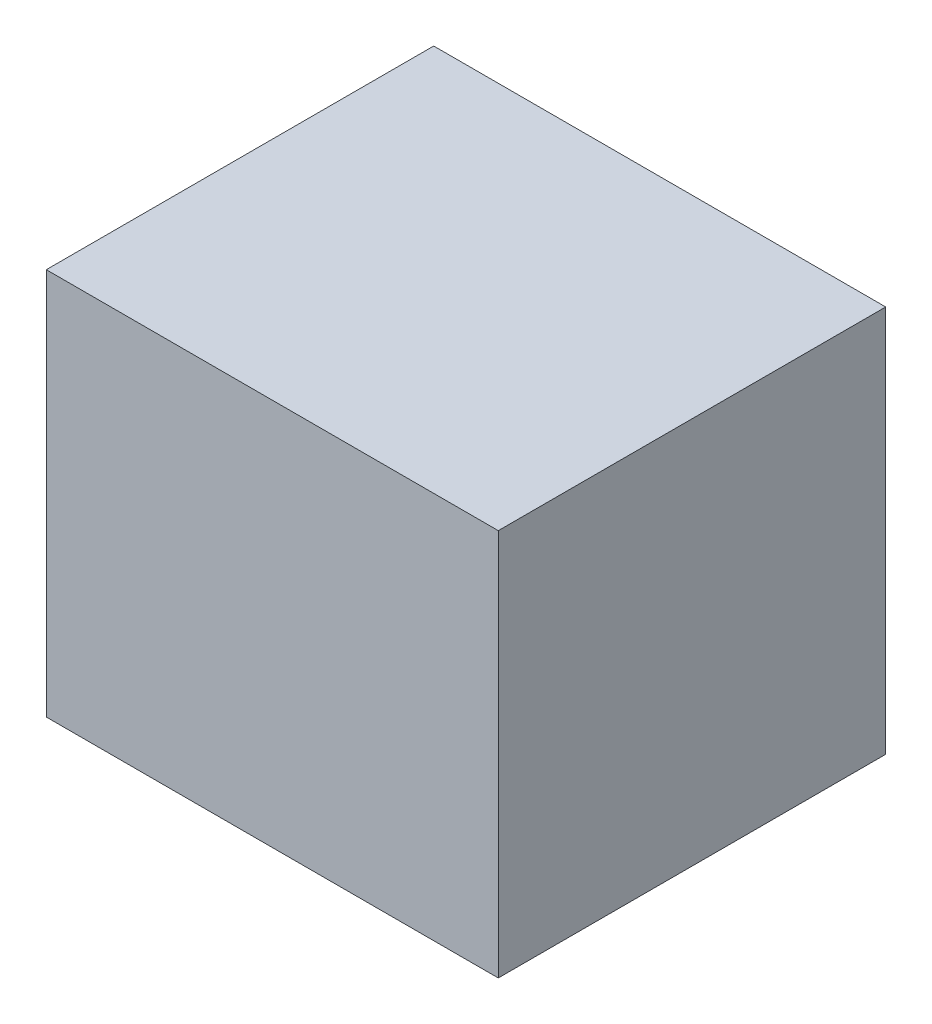
ISO-10303-21;
HEADER;
FILE_DESCRIPTION(('STEP AP214'),'2;1');
FILE_NAME('part.step','',(''),(''),'','','');
FILE_SCHEMA(('AUTOMOTIVE_DESIGN { 1 0 10303 214 1 1 1 1 }'));
ENDSEC;
DATA;
#1=APPLICATION_CONTEXT('core data for automotive mechanical design processes');
#2=APPLICATION_PROTOCOL_DEFINITION('international standard','automotive_design',2000,#1);
#3=PRODUCT_CONTEXT('',#1,'mechanical');
#4=PRODUCT('Part','Part','',(#3));
#5=PRODUCT_RELATED_PRODUCT_CATEGORY('part','',(#4));
#6=PRODUCT_DEFINITION_FORMATION('','',#4);
#7=PRODUCT_DEFINITION_CONTEXT('part definition',#1,'design');
#8=PRODUCT_DEFINITION('design','',#6,#7);
#9=PRODUCT_DEFINITION_SHAPE('','',#8);
#10=(LENGTH_UNIT() NAMED_UNIT(*) SI_UNIT(.MILLI.,.METRE.));
#11=(NAMED_UNIT(*) PLANE_ANGLE_UNIT() SI_UNIT($,.RADIAN.));
#12=(NAMED_UNIT(*) SI_UNIT($,.STERADIAN.) SOLID_ANGLE_UNIT());
#13=UNCERTAINTY_MEASURE_WITH_UNIT(LENGTH_MEASURE(1.E-05),#10,'distance_accuracy_value','');
#14=(GEOMETRIC_REPRESENTATION_CONTEXT(3) GLOBAL_UNCERTAINTY_ASSIGNED_CONTEXT((#13)) GLOBAL_UNIT_ASSIGNED_CONTEXT((#10,
#11,#12)) REPRESENTATION_CONTEXT('',''));
#15=CARTESIAN_POINT('',(0.,0.,0.));
#16=DIRECTION('',(0.,0.,1.));
#17=DIRECTION('',(1.,0.,0.));
#18=AXIS2_PLACEMENT_3D('',#15,#16,#17);
#19=CARTESIAN_POINT('',(-30.4528021271219,2.29096849845756,2.71031462000001));
#20=CARTESIAN_POINT('',(-30.4528021271219,2.29096849845756,1.99031606000001));
#21=CARTESIAN_POINT('',(-30.4528021271219,1.57096993845756,2.71031462000001));
#22=CARTESIAN_POINT('',(-30.4528021271219,1.57096993845756,1.99031606000001));
#23=(BOUNDED_SURFACE() B_SPLINE_SURFACE(1,1,((#19,#20),(#21,#22)),.UNSPECIFIED.,.F.,.F.,
.F.) B_SPLINE_SURFACE_WITH_KNOTS((2,2),(2,2),(-5.999988E-05,0.00065999868),(-0.00065999868,
5.999988E-05),.UNSPECIFIED.) GEOMETRIC_REPRESENTATION_ITEM() RATIONAL_B_SPLINE_SURFACE(((1.,1.),
(1.,1.))) REPRESENTATION_ITEM('') SURFACE());
#24=CARTESIAN_POINT('',(-30.4528021271219,1.63096981845756,2.05031594000001));
#25=CARTESIAN_POINT('',(-30.4528021271219,2.23096861845756,2.05031594000001));
#26=(BOUNDED_CURVE() B_SPLINE_CURVE(1,(#24,#25),.UNSPECIFIED.,.F.,
.F.) B_SPLINE_CURVE_WITH_KNOTS((2,2),(0.,0.0005999988),
.UNSPECIFIED.) CURVE() GEOMETRIC_REPRESENTATION_ITEM() RATIONAL_B_SPLINE_CURVE((1.,1.)) REPRESENTATION_ITEM(''));
#27=CARTESIAN_POINT('',(-30.4528021271219,1.63096981845756,2.05031594000001));
#28=VERTEX_POINT('',#27);
#29=CARTESIAN_POINT('',(-30.4528021271219,2.23096861845756,2.05031594000001));
#30=VERTEX_POINT('',#29);
#31=EDGE_CURVE('E23',#28,#30,#26,.T.);
#32=CARTESIAN_POINT('',(-30.4528021271219,2.23096861845756,2.05031594000001));
#33=CARTESIAN_POINT('',(-30.4528021271219,2.23096861845756,2.65031474000001));
#34=(BOUNDED_CURVE() B_SPLINE_CURVE(1,(#32,#33),.UNSPECIFIED.,.F.,
.F.) B_SPLINE_CURVE_WITH_KNOTS((2,2),(0.,0.0005999988),
.UNSPECIFIED.) CURVE() GEOMETRIC_REPRESENTATION_ITEM() RATIONAL_B_SPLINE_CURVE((1.,1.)) REPRESENTATION_ITEM(''));
#35=CARTESIAN_POINT('',(-30.4528021271219,2.23096861845756,2.65031474000001));
#36=VERTEX_POINT('',#35);
#37=EDGE_CURVE('E11',#30,#36,#34,.T.);
#38=CARTESIAN_POINT('',(-30.4528021271219,1.63096981845756,2.65031474000001));
#39=CARTESIAN_POINT('',(-30.4528021271219,2.23096861845756,2.65031474000001));
#40=(BOUNDED_CURVE() B_SPLINE_CURVE(1,(#38,#39),.UNSPECIFIED.,.F.,
.F.) B_SPLINE_CURVE_WITH_KNOTS((2,2),(0.,0.0005999988),
.UNSPECIFIED.) CURVE() GEOMETRIC_REPRESENTATION_ITEM() RATIONAL_B_SPLINE_CURVE((1.,1.)) REPRESENTATION_ITEM(''));
#41=CARTESIAN_POINT('',(-30.4528021271219,1.63096981845756,2.65031474000001));
#42=VERTEX_POINT('',#41);
#43=EDGE_CURVE('E112',#42,#36,#40,.T.);
#44=CARTESIAN_POINT('',(-30.4528021271219,1.63096981845756,2.05031594000001));
#45=CARTESIAN_POINT('',(-30.4528021271219,1.63096981845756,2.65031474000001));
#46=(BOUNDED_CURVE() B_SPLINE_CURVE(1,(#44,#45),.UNSPECIFIED.,.F.,
.F.) B_SPLINE_CURVE_WITH_KNOTS((2,2),(0.,0.0005999988),
.UNSPECIFIED.) CURVE() GEOMETRIC_REPRESENTATION_ITEM() RATIONAL_B_SPLINE_CURVE((1.,1.)) REPRESENTATION_ITEM(''));
#47=EDGE_CURVE('E71',#28,#42,#46,.T.);
#48=ORIENTED_EDGE('',*,*,#31,.T.);
#49=ORIENTED_EDGE('',*,*,#37,.T.);
#50=ORIENTED_EDGE('',*,*,#43,.F.);
#51=ORIENTED_EDGE('',*,*,#47,.F.);
#52=EDGE_LOOP('',(#48,#49,#50,#51));
#53=FACE_BOUND('',#52,.T.);
#54=ADVANCED_FACE('F17',(#53),#23,.T.);
#55=CARTESIAN_POINT('',(-31.2228033811219,2.23096861845756,2.71031462000001));
#56=CARTESIAN_POINT('',(-31.2228033811219,2.23096861845756,1.99031606000001));
#57=CARTESIAN_POINT('',(-30.3828020131219,2.23096861845756,2.71031462000001));
#58=CARTESIAN_POINT('',(-30.3828020131219,2.23096861845756,1.99031606000001));
#59=(BOUNDED_SURFACE() B_SPLINE_SURFACE(1,1,((#55,#56),(#57,#58)),.UNSPECIFIED.,.F.,.F.,
.F.) B_SPLINE_SURFACE_WITH_KNOTS((2,2),(2,2),(-7.0000114E-05,0.000770001254),(-0.00065999868,
5.999988E-05),.UNSPECIFIED.) GEOMETRIC_REPRESENTATION_ITEM() RATIONAL_B_SPLINE_SURFACE(((1.,1.),
(1.,1.))) REPRESENTATION_ITEM('') SURFACE());
#60=CARTESIAN_POINT('',(-30.4528021271219,2.23096861845756,2.05031594000001));
#61=CARTESIAN_POINT('',(-31.1528032671219,2.23096861845756,2.05031594000001));
#62=(BOUNDED_CURVE() B_SPLINE_CURVE(1,(#60,#61),.UNSPECIFIED.,.F.,
.F.) B_SPLINE_CURVE_WITH_KNOTS((2,2),(0.,0.000700001139999999),
.UNSPECIFIED.) CURVE() GEOMETRIC_REPRESENTATION_ITEM() RATIONAL_B_SPLINE_CURVE((1.,1.)) REPRESENTATION_ITEM(''));
#63=CARTESIAN_POINT('',(-31.1528032671219,2.23096861845756,2.05031594000001));
#64=VERTEX_POINT('',#63);
#65=EDGE_CURVE('E79',#30,#64,#62,.T.);
#66=CARTESIAN_POINT('',(-31.1528032671219,2.23096861845756,2.05031594000001));
#67=CARTESIAN_POINT('',(-31.1528032671219,2.23096861845756,2.65031474000001));
#68=(BOUNDED_CURVE() B_SPLINE_CURVE(1,(#66,#67),.UNSPECIFIED.,.F.,
.F.) B_SPLINE_CURVE_WITH_KNOTS((2,2),(0.,0.0005999988),
.UNSPECIFIED.) CURVE() GEOMETRIC_REPRESENTATION_ITEM() RATIONAL_B_SPLINE_CURVE((1.,1.)) REPRESENTATION_ITEM(''));
#69=CARTESIAN_POINT('',(-31.1528032671219,2.23096861845756,2.65031474000001));
#70=VERTEX_POINT('',#69);
#71=EDGE_CURVE('E32',#64,#70,#68,.T.);
#72=CARTESIAN_POINT('',(-30.4528021271219,2.23096861845756,2.65031474000001));
#73=CARTESIAN_POINT('',(-31.1528032671219,2.23096861845756,2.65031474000001));
#74=(BOUNDED_CURVE() B_SPLINE_CURVE(1,(#72,#73),.UNSPECIFIED.,.F.,
.F.) B_SPLINE_CURVE_WITH_KNOTS((2,2),(0.,0.000700001139999999),
.UNSPECIFIED.) CURVE() GEOMETRIC_REPRESENTATION_ITEM() RATIONAL_B_SPLINE_CURVE((1.,1.)) REPRESENTATION_ITEM(''));
#75=EDGE_CURVE('E121',#36,#70,#74,.T.);
#76=ORIENTED_EDGE('',*,*,#65,.T.);
#77=ORIENTED_EDGE('',*,*,#71,.T.);
#78=ORIENTED_EDGE('',*,*,#75,.F.);
#79=ORIENTED_EDGE('',*,*,#37,.F.);
#80=EDGE_LOOP('',(#76,#77,#78,#79));
#81=FACE_BOUND('',#80,.T.);
#82=ADVANCED_FACE('F166',(#81),#59,.T.);
#83=CARTESIAN_POINT('',(-31.1528032671219,1.57096993845756,2.71031462000001));
#84=CARTESIAN_POINT('',(-31.1528032671219,1.57096993845756,1.99031606000001));
#85=CARTESIAN_POINT('',(-31.1528032671219,2.29096849845756,2.71031462000001));
#86=CARTESIAN_POINT('',(-31.1528032671219,2.29096849845756,1.99031606000001));
#87=(BOUNDED_SURFACE() B_SPLINE_SURFACE(1,1,((#83,#84),(#85,#86)),.UNSPECIFIED.,.F.,.F.,
.F.) B_SPLINE_SURFACE_WITH_KNOTS((2,2),(2,2),(-5.999988E-05,0.00065999868),(-0.00065999868,
5.999988E-05),.UNSPECIFIED.) GEOMETRIC_REPRESENTATION_ITEM() RATIONAL_B_SPLINE_SURFACE(((1.,1.),
(1.,1.))) REPRESENTATION_ITEM('') SURFACE());
#88=CARTESIAN_POINT('',(-31.1528032671219,2.23096861845756,2.05031594000001));
#89=CARTESIAN_POINT('',(-31.1528032671219,1.63096981845756,2.05031594000001));
#90=(BOUNDED_CURVE() B_SPLINE_CURVE(1,(#88,#89),.UNSPECIFIED.,.F.,
.F.) B_SPLINE_CURVE_WITH_KNOTS((2,2),(0.,0.0005999988),
.UNSPECIFIED.) CURVE() GEOMETRIC_REPRESENTATION_ITEM() RATIONAL_B_SPLINE_CURVE((1.,1.)) REPRESENTATION_ITEM(''));
#91=CARTESIAN_POINT('',(-31.1528032671219,1.63096981845756,2.05031594000001));
#92=VERTEX_POINT('',#91);
#93=EDGE_CURVE('E74',#64,#92,#90,.T.);
#94=CARTESIAN_POINT('',(-31.1528032671219,1.63096981845756,2.05031594000001));
#95=CARTESIAN_POINT('',(-31.1528032671219,1.63096981845756,2.65031474000001));
#96=(BOUNDED_CURVE() B_SPLINE_CURVE(1,(#94,#95),.UNSPECIFIED.,.F.,
.F.) B_SPLINE_CURVE_WITH_KNOTS((2,2),(0.,0.0005999988),
.UNSPECIFIED.) CURVE() GEOMETRIC_REPRESENTATION_ITEM() RATIONAL_B_SPLINE_CURVE((1.,1.)) REPRESENTATION_ITEM(''));
#97=CARTESIAN_POINT('',(-31.1528032671219,1.63096981845756,2.65031474000001));
#98=VERTEX_POINT('',#97);
#99=EDGE_CURVE('E59',#92,#98,#96,.T.);
#100=CARTESIAN_POINT('',(-31.1528032671219,2.23096861845756,2.65031474000001));
#101=CARTESIAN_POINT('',(-31.1528032671219,1.63096981845756,2.65031474000001));
#102=(BOUNDED_CURVE() B_SPLINE_CURVE(1,(#100,#101),.UNSPECIFIED.,.F.,
.F.) B_SPLINE_CURVE_WITH_KNOTS((2,2),(0.,0.0005999988),
.UNSPECIFIED.) CURVE() GEOMETRIC_REPRESENTATION_ITEM() RATIONAL_B_SPLINE_CURVE((1.,1.)) REPRESENTATION_ITEM(''));
#103=EDGE_CURVE('E88',#70,#98,#102,.T.);
#104=ORIENTED_EDGE('',*,*,#93,.T.);
#105=ORIENTED_EDGE('',*,*,#99,.T.);
#106=ORIENTED_EDGE('',*,*,#103,.F.);
#107=ORIENTED_EDGE('',*,*,#71,.F.);
#108=EDGE_LOOP('',(#104,#105,#106,#107));
#109=FACE_BOUND('',#108,.T.);
#110=ADVANCED_FACE('F75',(#109),#87,.T.);
#111=CARTESIAN_POINT('',(-30.3828020131219,1.63096981845756,2.71031462000001));
#112=CARTESIAN_POINT('',(-30.3828020131219,1.63096981845756,1.99031606000001));
#113=CARTESIAN_POINT('',(-31.2228033811219,1.63096981845756,2.71031462000001));
#114=CARTESIAN_POINT('',(-31.2228033811219,1.63096981845756,1.99031606000001));
#115=(BOUNDED_SURFACE() B_SPLINE_SURFACE(1,1,((#111,#112),(#113,#114)),.UNSPECIFIED.,.F.,.F.,
.F.) B_SPLINE_SURFACE_WITH_KNOTS((2,2),(2,2),(-7.0000114E-05,0.000770001254),(-0.00065999868,
5.999988E-05),.UNSPECIFIED.) GEOMETRIC_REPRESENTATION_ITEM() RATIONAL_B_SPLINE_SURFACE(((1.,1.),
(1.,1.))) REPRESENTATION_ITEM('') SURFACE());
#116=CARTESIAN_POINT('',(-31.1528032671219,1.63096981845756,2.05031594000001));
#117=CARTESIAN_POINT('',(-30.4528021271219,1.63096981845756,2.05031594000001));
#118=(BOUNDED_CURVE() B_SPLINE_CURVE(1,(#116,#117),.UNSPECIFIED.,.F.,
.F.) B_SPLINE_CURVE_WITH_KNOTS((2,2),(0.,0.000700001139999999),
.UNSPECIFIED.) CURVE() GEOMETRIC_REPRESENTATION_ITEM() RATIONAL_B_SPLINE_CURVE((1.,1.)) REPRESENTATION_ITEM(''));
#119=EDGE_CURVE('E64',#92,#28,#118,.T.);
#120=CARTESIAN_POINT('',(-31.1528032671219,1.63096981845756,2.65031474000001));
#121=CARTESIAN_POINT('',(-30.4528021271219,1.63096981845756,2.65031474000001));
#122=(BOUNDED_CURVE() B_SPLINE_CURVE(1,(#120,#121),.UNSPECIFIED.,.F.,
.F.) B_SPLINE_CURVE_WITH_KNOTS((2,2),(0.,0.000700001139999999),
.UNSPECIFIED.) CURVE() GEOMETRIC_REPRESENTATION_ITEM() RATIONAL_B_SPLINE_CURVE((1.,1.)) REPRESENTATION_ITEM(''));
#123=EDGE_CURVE('E66',#98,#42,#122,.T.);
#124=ORIENTED_EDGE('',*,*,#119,.T.);
#125=ORIENTED_EDGE('',*,*,#47,.T.);
#126=ORIENTED_EDGE('',*,*,#123,.F.);
#127=ORIENTED_EDGE('',*,*,#99,.F.);
#128=EDGE_LOOP('',(#124,#125,#126,#127));
#129=FACE_BOUND('',#128,.T.);
#130=ADVANCED_FACE('F61',(#129),#115,.T.);
#131=CARTESIAN_POINT('',(-30.3828020131219,1.57096993845756,2.05031594000001));
#132=CARTESIAN_POINT('',(-30.3828020131219,2.29096849845756,2.05031594000001));
#133=CARTESIAN_POINT('',(-31.2228033811219,1.57096993845756,2.05031594000001));
#134=CARTESIAN_POINT('',(-31.2228033811219,2.29096849845756,2.05031594000001));
#135=(BOUNDED_SURFACE() B_SPLINE_SURFACE(1,1,((#131,#132),(#133,#134)),.UNSPECIFIED.,.F.,.F.,
.F.) B_SPLINE_SURFACE_WITH_KNOTS((2,2),(2,2),(-7.0000114E-05,0.000770001254),(-5.999988E-05,
0.00065999868),.UNSPECIFIED.) GEOMETRIC_REPRESENTATION_ITEM() RATIONAL_B_SPLINE_SURFACE(((1.,
1.),(1.,1.))) REPRESENTATION_ITEM('') SURFACE());
#136=ORIENTED_EDGE('',*,*,#119,.F.);
#137=ORIENTED_EDGE('',*,*,#93,.F.);
#138=ORIENTED_EDGE('',*,*,#65,.F.);
#139=ORIENTED_EDGE('',*,*,#31,.F.);
#140=EDGE_LOOP('',(#136,#137,#138,#139));
#141=FACE_BOUND('',#140,.T.);
#142=ADVANCED_FACE('F19',(#141),#135,.T.);
#143=CARTESIAN_POINT('',(-31.2228033811219,1.57096993845756,2.65031474000001));
#144=CARTESIAN_POINT('',(-31.2228033811219,2.29096849845756,2.65031474000001));
#145=CARTESIAN_POINT('',(-30.3828020131219,1.57096993845756,2.65031474000001));
#146=CARTESIAN_POINT('',(-30.3828020131219,2.29096849845756,2.65031474000001));
#147=(BOUNDED_SURFACE() B_SPLINE_SURFACE(1,1,((#143,#144),(#145,#146)),.UNSPECIFIED.,.F.,.F.,
.F.) B_SPLINE_SURFACE_WITH_KNOTS((2,2),(2,2),(-7.0000114E-05,0.000770001254),(-5.999988E-05,
0.00065999868),.UNSPECIFIED.) GEOMETRIC_REPRESENTATION_ITEM() RATIONAL_B_SPLINE_SURFACE(((1.,
1.),(1.,1.))) REPRESENTATION_ITEM('') SURFACE());
#148=ORIENTED_EDGE('',*,*,#43,.T.);
#149=ORIENTED_EDGE('',*,*,#75,.T.);
#150=ORIENTED_EDGE('',*,*,#103,.T.);
#151=ORIENTED_EDGE('',*,*,#123,.T.);
#152=EDGE_LOOP('',(#148,#149,#150,#151));
#153=FACE_BOUND('',#152,.T.);
#154=ADVANCED_FACE('F169',(#153),#147,.T.);
#155=CLOSED_SHELL('',(#54,#82,#110,#130,#142,#154));
#156=MANIFOLD_SOLID_BREP('B1',#155);
#157=ADVANCED_BREP_SHAPE_REPRESENTATION('',(#18,#156),#14);
#158=SHAPE_DEFINITION_REPRESENTATION(#9,#157);
ENDSEC;
END-ISO-10303-21;
